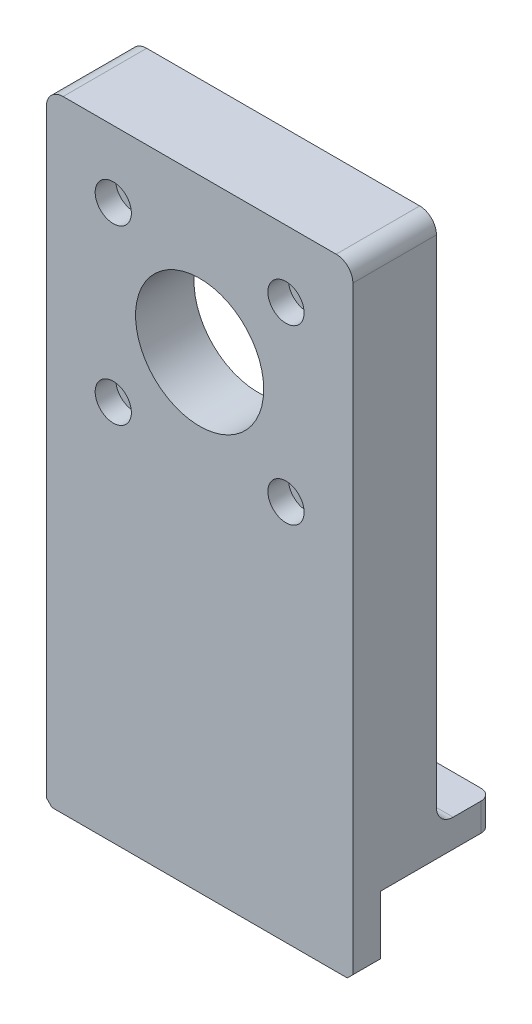
ISO-10303-21;
HEADER;
FILE_DESCRIPTION(('STEP AP214'),'2;1');
FILE_NAME('part.step','',(''),(''),'','','');
FILE_SCHEMA(('AUTOMOTIVE_DESIGN { 1 0 10303 214 1 1 1 1 }'));
ENDSEC;
DATA;
#1=APPLICATION_CONTEXT('core data for automotive mechanical design processes');
#2=APPLICATION_PROTOCOL_DEFINITION('international standard','automotive_design',2000,#1);
#3=PRODUCT_CONTEXT('',#1,'mechanical');
#4=PRODUCT('Part','Part','',(#3));
#5=PRODUCT_RELATED_PRODUCT_CATEGORY('part','',(#4));
#6=PRODUCT_DEFINITION_FORMATION('','',#4);
#7=PRODUCT_DEFINITION_CONTEXT('part definition',#1,'design');
#8=PRODUCT_DEFINITION('design','',#6,#7);
#9=PRODUCT_DEFINITION_SHAPE('','',#8);
#10=(LENGTH_UNIT() NAMED_UNIT(*) SI_UNIT(.MILLI.,.METRE.));
#11=(NAMED_UNIT(*) PLANE_ANGLE_UNIT() SI_UNIT($,.RADIAN.));
#12=(NAMED_UNIT(*) SI_UNIT($,.STERADIAN.) SOLID_ANGLE_UNIT());
#13=UNCERTAINTY_MEASURE_WITH_UNIT(LENGTH_MEASURE(1.E-05),#10,'distance_accuracy_value','');
#14=(GEOMETRIC_REPRESENTATION_CONTEXT(3) GLOBAL_UNCERTAINTY_ASSIGNED_CONTEXT((#13)) GLOBAL_UNIT_ASSIGNED_CONTEXT((#10,
#11,#12)) REPRESENTATION_CONTEXT('',''));
#15=CARTESIAN_POINT('',(0.,0.,0.));
#16=DIRECTION('',(0.,0.,1.));
#17=DIRECTION('',(1.,0.,0.));
#18=AXIS2_PLACEMENT_3D('',#15,#16,#17);
#19=CARTESIAN_POINT('',(0.,0.,-15.));
#20=DIRECTION('',(0.,0.,1.));
#21=DIRECTION('',(1.,0.,0.));
#22=AXIS2_PLACEMENT_3D('',#19,#20,#21);
#23=PLANE('',#22);
#24=DIRECTION('',(1.,0.,0.));
#25=VECTOR('',#24,1.);
#26=CARTESIAN_POINT('',(21.65,21.65,-15.));
#27=LINE('',#26,#25);
#28=CARTESIAN_POINT('',(-21.65,21.65,-15.));
#29=VERTEX_POINT('',#28);
#30=CARTESIAN_POINT('',(21.65,21.65,-15.));
#31=VERTEX_POINT('',#30);
#32=EDGE_CURVE('E212',#29,#31,#27,.T.);
#33=ORIENTED_EDGE('',*,*,#32,.F.);
#34=DIRECTION('',(0.,1.,0.));
#35=VECTOR('',#34,1.);
#36=CARTESIAN_POINT('',(-21.65,-21.65,-15.));
#37=LINE('',#36,#35);
#38=CARTESIAN_POINT('',(-21.65,-21.65,-15.));
#39=VERTEX_POINT('',#38);
#40=EDGE_CURVE('E181',#39,#29,#37,.T.);
#41=ORIENTED_EDGE('',*,*,#40,.F.);
#42=DIRECTION('',(-1.,0.,0.));
#43=VECTOR('',#42,1.);
#44=CARTESIAN_POINT('',(21.65,-21.65,-15.));
#45=LINE('',#44,#43);
#46=CARTESIAN_POINT('',(21.65,-21.65,-15.));
#47=VERTEX_POINT('',#46);
#48=EDGE_CURVE('E198',#47,#39,#45,.T.);
#49=ORIENTED_EDGE('',*,*,#48,.F.);
#50=DIRECTION('',(0.,-1.,0.));
#51=VECTOR('',#50,1.);
#52=CARTESIAN_POINT('',(21.65,-21.65,-15.));
#53=LINE('',#52,#51);
#54=EDGE_CURVE('E205',#31,#47,#53,.T.);
#55=ORIENTED_EDGE('',*,*,#54,.F.);
#56=EDGE_LOOP('',(#33,#41,#49,#55));
#57=FACE_BOUND('',#56,.T.);
#58=DIRECTION('',(0.,-1.,0.));
#59=VECTOR('',#58,1.);
#60=CARTESIAN_POINT('',(27.5,0.,-15.));
#61=LINE('',#60,#59);
#62=CARTESIAN_POINT('',(27.5,24.5,-15.));
#63=VERTEX_POINT('',#62);
#64=CARTESIAN_POINT('',(27.5,-64.5,-15.));
#65=VERTEX_POINT('',#64);
#66=EDGE_CURVE('E240',#63,#65,#61,.T.);
#67=ORIENTED_EDGE('',*,*,#66,.T.);
#68=DIRECTION('',(1.,0.,0.));
#69=VECTOR('',#68,1.);
#70=CARTESIAN_POINT('',(-27.5,-64.5,-15.));
#71=LINE('',#70,#69);
#72=CARTESIAN_POINT('',(-27.5,-64.5,-15.));
#73=VERTEX_POINT('',#72);
#74=EDGE_CURVE('E61',#65,#73,#71,.F.);
#75=ORIENTED_EDGE('',*,*,#74,.T.);
#76=DIRECTION('',(0.,-1.,0.));
#77=VECTOR('',#76,1.);
#78=CARTESIAN_POINT('',(-27.5,0.,-15.));
#79=LINE('',#78,#77);
#80=CARTESIAN_POINT('',(-27.5,24.5,-15.));
#81=VERTEX_POINT('',#80);
#82=EDGE_CURVE('E247',#81,#73,#79,.T.);
#83=ORIENTED_EDGE('',*,*,#82,.F.);
#84=CARTESIAN_POINT('',(-24.5,24.5,-15.));
#85=DIRECTION('',(0.,0.,1.));
#86=DIRECTION('',(1.,0.,0.));
#87=AXIS2_PLACEMENT_3D('',#84,#85,#86);
#88=CIRCLE('',#87,3.);
#89=CARTESIAN_POINT('',(-24.5,27.5,-15.));
#90=VERTEX_POINT('',#89);
#91=EDGE_CURVE('E244',#90,#81,#88,.T.);
#92=ORIENTED_EDGE('',*,*,#91,.F.);
#93=DIRECTION('',(1.,0.,0.));
#94=VECTOR('',#93,1.);
#95=CARTESIAN_POINT('',(0.,27.5,-15.));
#96=LINE('',#95,#94);
#97=CARTESIAN_POINT('',(24.5,27.5,-15.));
#98=VERTEX_POINT('',#97);
#99=EDGE_CURVE('E243',#90,#98,#96,.T.);
#100=ORIENTED_EDGE('',*,*,#99,.T.);
#101=CARTESIAN_POINT('',(24.5,24.5,-15.));
#102=DIRECTION('',(0.,0.,1.));
#103=DIRECTION('',(1.,0.,0.));
#104=AXIS2_PLACEMENT_3D('',#101,#102,#103);
#105=CIRCLE('',#104,3.);
#106=EDGE_CURVE('E237',#63,#98,#105,.T.);
#107=ORIENTED_EDGE('',*,*,#106,.F.);
#108=EDGE_LOOP('',(#67,#75,#83,#92,#100,#107));
#109=FACE_BOUND('',#108,.T.);
#110=ADVANCED_FACE('F43',(#57,#109),#23,.F.);
#111=CARTESIAN_POINT('',(0.,-72.5,-15.));
#112=DIRECTION('',(0.,1.,0.));
#113=DIRECTION('',(0.,0.,1.));
#114=AXIS2_PLACEMENT_3D('',#111,#112,#113);
#115=PLANE('',#114);
#116=DIRECTION('',(0.,0.,1.));
#117=VECTOR('',#116,1.);
#118=CARTESIAN_POINT('',(-27.5,-72.5,-15.));
#119=LINE('',#118,#117);
#120=CARTESIAN_POINT('',(-27.5,-72.5,-23.));
#121=VERTEX_POINT('',#120);
#122=CARTESIAN_POINT('',(-27.5,-72.5,-5.));
#123=VERTEX_POINT('',#122);
#124=EDGE_CURVE('E269',#121,#123,#119,.T.);
#125=ORIENTED_EDGE('',*,*,#124,.F.);
#126=CARTESIAN_POINT('',(-25.5,-72.5,-23.));
#127=DIRECTION('',(0.,1.,0.));
#128=DIRECTION('',(0.,0.,1.));
#129=AXIS2_PLACEMENT_3D('',#126,#127,#128);
#130=CIRCLE('',#129,2.);
#131=CARTESIAN_POINT('',(-25.5,-72.5,-25.));
#132=VERTEX_POINT('',#131);
#133=EDGE_CURVE('E315',#121,#132,#130,.F.);
#134=ORIENTED_EDGE('',*,*,#133,.T.);
#135=DIRECTION('',(-1.,0.,0.));
#136=VECTOR('',#135,1.);
#137=CARTESIAN_POINT('',(27.5,-72.5,-25.));
#138=LINE('',#137,#136);
#139=CARTESIAN_POINT('',(25.5,-72.5,-25.));
#140=VERTEX_POINT('',#139);
#141=EDGE_CURVE('E336',#140,#132,#138,.T.);
#142=ORIENTED_EDGE('',*,*,#141,.F.);
#143=CARTESIAN_POINT('',(25.5,-72.5,-23.));
#144=DIRECTION('',(0.,1.,0.));
#145=DIRECTION('',(0.,0.,1.));
#146=AXIS2_PLACEMENT_3D('',#143,#144,#145);
#147=CIRCLE('',#146,2.);
#148=CARTESIAN_POINT('',(27.5,-72.5,-23.));
#149=VERTEX_POINT('',#148);
#150=EDGE_CURVE('E309',#140,#149,#147,.F.);
#151=ORIENTED_EDGE('',*,*,#150,.T.);
#152=DIRECTION('',(0.,0.,1.));
#153=VECTOR('',#152,1.);
#154=CARTESIAN_POINT('',(27.5,-72.5,-15.));
#155=LINE('',#154,#153);
#156=CARTESIAN_POINT('',(27.5,-72.5,-5.));
#157=VERTEX_POINT('',#156);
#158=EDGE_CURVE('E270',#149,#157,#155,.T.);
#159=ORIENTED_EDGE('',*,*,#158,.T.);
#160=DIRECTION('',(1.,0.,0.));
#161=VECTOR('',#160,1.);
#162=CARTESIAN_POINT('',(-27.5,-72.5,-5.));
#163=LINE('',#162,#161);
#164=EDGE_CURVE('E224',#123,#157,#163,.T.);
#165=ORIENTED_EDGE('',*,*,#164,.F.);
#166=EDGE_LOOP('',(#125,#134,#142,#151,#159,#165));
#167=FACE_BOUND('',#166,.T.);
#168=ADVANCED_FACE('F407',(#167),#115,.F.);
#169=CARTESIAN_POINT('',(27.5,0.,-15.));
#170=DIRECTION('',(-1.,0.,0.));
#171=DIRECTION('',(0.,-1.,0.));
#172=AXIS2_PLACEMENT_3D('',#169,#170,#171);
#173=PLANE('',#172);
#174=ORIENTED_EDGE('',*,*,#158,.F.);
#175=DIRECTION('',(0.,-1.,0.));
#176=VECTOR('',#175,1.);
#177=CARTESIAN_POINT('',(27.5,0.,-23.));
#178=LINE('',#177,#176);
#179=CARTESIAN_POINT('',(27.5,-67.5,-23.));
#180=VERTEX_POINT('',#179);
#181=EDGE_CURVE('E313',#149,#180,#178,.F.);
#182=ORIENTED_EDGE('',*,*,#181,.T.);
#183=DIRECTION('',(0.,0.,1.));
#184=VECTOR('',#183,1.);
#185=CARTESIAN_POINT('',(27.5,-67.5,-25.));
#186=LINE('',#185,#184);
#187=CARTESIAN_POINT('',(27.5,-67.5,-18.));
#188=VERTEX_POINT('',#187);
#189=EDGE_CURVE('E321',#180,#188,#186,.T.);
#190=ORIENTED_EDGE('',*,*,#189,.T.);
#191=CARTESIAN_POINT('',(27.5,-64.5,-18.));
#192=DIRECTION('',(-1.,0.,0.));
#193=DIRECTION('',(0.,-1.,0.));
#194=AXIS2_PLACEMENT_3D('',#191,#192,#193);
#195=CIRCLE('',#194,3.);
#196=EDGE_CURVE('E51',#188,#65,#195,.T.);
#197=ORIENTED_EDGE('',*,*,#196,.T.);
#198=ORIENTED_EDGE('',*,*,#66,.F.);
#199=DIRECTION('',(0.,0.,1.));
#200=VECTOR('',#199,1.);
#201=CARTESIAN_POINT('',(27.5,24.5,-15.));
#202=LINE('',#201,#200);
#203=CARTESIAN_POINT('',(27.5,24.5,0.));
#204=VERTEX_POINT('',#203);
#205=EDGE_CURVE('E249',#63,#204,#202,.T.);
#206=ORIENTED_EDGE('',*,*,#205,.T.);
#207=DIRECTION('',(0.,-1.,0.));
#208=VECTOR('',#207,1.);
#209=CARTESIAN_POINT('',(27.5,0.,0.));
#210=LINE('',#209,#208);
#211=CARTESIAN_POINT('',(27.5,-83.,0.));
#212=VERTEX_POINT('',#211);
#213=EDGE_CURVE('E254',#204,#212,#210,.T.);
#214=ORIENTED_EDGE('',*,*,#213,.T.);
#215=DIRECTION('',(0.,0.,-1.));
#216=VECTOR('',#215,1.);
#217=CARTESIAN_POINT('',(27.5,-83.,-15.));
#218=LINE('',#217,#216);
#219=CARTESIAN_POINT('',(27.5,-83.,-5.));
#220=VERTEX_POINT('',#219);
#221=EDGE_CURVE('E288',#212,#220,#218,.T.);
#222=ORIENTED_EDGE('',*,*,#221,.T.);
#223=DIRECTION('',(0.,1.,0.));
#224=VECTOR('',#223,1.);
#225=CARTESIAN_POINT('',(27.5,-84.,-5.));
#226=LINE('',#225,#224);
#227=EDGE_CURVE('E226',#220,#157,#226,.T.);
#228=ORIENTED_EDGE('',*,*,#227,.T.);
#229=EDGE_LOOP('',(#174,#182,#190,#197,#198,#206,#214,#222,#228));
#230=FACE_BOUND('',#229,.T.);
#231=ADVANCED_FACE('F331',(#230),#173,.F.);
#232=CARTESIAN_POINT('',(-27.5,0.,-15.));
#233=DIRECTION('',(-1.,0.,0.));
#234=DIRECTION('',(0.,-1.,0.));
#235=AXIS2_PLACEMENT_3D('',#232,#233,#234);
#236=PLANE('',#235);
#237=DIRECTION('',(0.,0.,1.));
#238=VECTOR('',#237,1.);
#239=CARTESIAN_POINT('',(-27.5,-67.5,-25.));
#240=LINE('',#239,#238);
#241=CARTESIAN_POINT('',(-27.5,-67.5,-23.));
#242=VERTEX_POINT('',#241);
#243=CARTESIAN_POINT('',(-27.5,-67.5,-18.));
#244=VERTEX_POINT('',#243);
#245=EDGE_CURVE('E326',#242,#244,#240,.T.);
#246=ORIENTED_EDGE('',*,*,#245,.F.);
#247=DIRECTION('',(0.,1.,0.));
#248=VECTOR('',#247,1.);
#249=CARTESIAN_POINT('',(-27.5,-72.5,-23.));
#250=LINE('',#249,#248);
#251=EDGE_CURVE('E308',#242,#121,#250,.F.);
#252=ORIENTED_EDGE('',*,*,#251,.T.);
#253=ORIENTED_EDGE('',*,*,#124,.T.);
#254=DIRECTION('',(0.,1.,0.));
#255=VECTOR('',#254,1.);
#256=CARTESIAN_POINT('',(-27.5,-84.,-5.));
#257=LINE('',#256,#255);
#258=CARTESIAN_POINT('',(-27.5,-83.,-5.));
#259=VERTEX_POINT('',#258);
#260=EDGE_CURVE('E231',#259,#123,#257,.T.);
#261=ORIENTED_EDGE('',*,*,#260,.F.);
#262=DIRECTION('',(0.,0.,1.));
#263=VECTOR('',#262,1.);
#264=CARTESIAN_POINT('',(-27.5,-83.,0.));
#265=LINE('',#264,#263);
#266=CARTESIAN_POINT('',(-27.5,-83.,0.));
#267=VERTEX_POINT('',#266);
#268=EDGE_CURVE('E295',#259,#267,#265,.T.);
#269=ORIENTED_EDGE('',*,*,#268,.T.);
#270=DIRECTION('',(0.,-1.,0.));
#271=VECTOR('',#270,1.);
#272=CARTESIAN_POINT('',(-27.5,0.,0.));
#273=LINE('',#272,#271);
#274=CARTESIAN_POINT('',(-27.5,24.5,0.));
#275=VERTEX_POINT('',#274);
#276=EDGE_CURVE('E239',#275,#267,#273,.T.);
#277=ORIENTED_EDGE('',*,*,#276,.F.);
#278=DIRECTION('',(0.,0.,1.));
#279=VECTOR('',#278,1.);
#280=CARTESIAN_POINT('',(-27.5,24.5,-15.));
#281=LINE('',#280,#279);
#282=EDGE_CURVE('E275',#81,#275,#281,.T.);
#283=ORIENTED_EDGE('',*,*,#282,.F.);
#284=ORIENTED_EDGE('',*,*,#82,.T.);
#285=CARTESIAN_POINT('',(-27.5,-64.5,-18.));
#286=DIRECTION('',(-1.,0.,0.));
#287=DIRECTION('',(0.,-1.,0.));
#288=AXIS2_PLACEMENT_3D('',#285,#286,#287);
#289=CIRCLE('',#288,3.);
#290=EDGE_CURVE('E11',#73,#244,#289,.F.);
#291=ORIENTED_EDGE('',*,*,#290,.T.);
#292=EDGE_LOOP('',(#246,#252,#253,#261,#269,#277,#283,#284,#291));
#293=FACE_BOUND('',#292,.T.);
#294=ADVANCED_FACE('F424',(#293),#236,.T.);
#295=CARTESIAN_POINT('',(-24.5,24.5,-15.));
#296=DIRECTION('',(0.,0.,1.));
#297=DIRECTION('',(1.,0.,0.));
#298=AXIS2_PLACEMENT_3D('',#295,#296,#297);
#299=CYLINDRICAL_SURFACE('',#298,3.);
#300=CARTESIAN_POINT('',(-24.5,24.5,0.));
#301=DIRECTION('',(0.,0.,1.));
#302=DIRECTION('',(1.,0.,0.));
#303=AXIS2_PLACEMENT_3D('',#300,#301,#302);
#304=CIRCLE('',#303,3.);
#305=CARTESIAN_POINT('',(-24.5,27.5,0.));
#306=VERTEX_POINT('',#305);
#307=EDGE_CURVE('E261',#306,#275,#304,.T.);
#308=ORIENTED_EDGE('',*,*,#307,.F.);
#309=DIRECTION('',(0.,0.,1.));
#310=VECTOR('',#309,1.);
#311=CARTESIAN_POINT('',(-24.5,27.5,-15.));
#312=LINE('',#311,#310);
#313=EDGE_CURVE('E274',#90,#306,#312,.T.);
#314=ORIENTED_EDGE('',*,*,#313,.F.);
#315=ORIENTED_EDGE('',*,*,#91,.T.);
#316=ORIENTED_EDGE('',*,*,#282,.T.);
#317=EDGE_LOOP('',(#308,#314,#315,#316));
#318=FACE_BOUND('',#317,.T.);
#319=ADVANCED_FACE('F426',(#318),#299,.T.);
#320=CARTESIAN_POINT('',(0.,27.5,-15.));
#321=DIRECTION('',(0.,-1.,0.));
#322=DIRECTION('',(0.,0.,-1.));
#323=AXIS2_PLACEMENT_3D('',#320,#321,#322);
#324=PLANE('',#323);
#325=DIRECTION('',(1.,0.,0.));
#326=VECTOR('',#325,1.);
#327=CARTESIAN_POINT('',(0.,27.5,0.));
#328=LINE('',#327,#326);
#329=CARTESIAN_POINT('',(24.5,27.5,0.));
#330=VERTEX_POINT('',#329);
#331=EDGE_CURVE('E256',#306,#330,#328,.T.);
#332=ORIENTED_EDGE('',*,*,#331,.T.);
#333=DIRECTION('',(0.,0.,1.));
#334=VECTOR('',#333,1.);
#335=CARTESIAN_POINT('',(24.5,27.5,-15.));
#336=LINE('',#335,#334);
#337=EDGE_CURVE('E277',#98,#330,#336,.T.);
#338=ORIENTED_EDGE('',*,*,#337,.F.);
#339=ORIENTED_EDGE('',*,*,#99,.F.);
#340=ORIENTED_EDGE('',*,*,#313,.T.);
#341=EDGE_LOOP('',(#332,#338,#339,#340));
#342=FACE_BOUND('',#341,.T.);
#343=ADVANCED_FACE('F435',(#342),#324,.F.);
#344=CARTESIAN_POINT('',(0.,0.,-15.));
#345=DIRECTION('',(0.,0.,1.));
#346=DIRECTION('',(1.,0.,0.));
#347=AXIS2_PLACEMENT_3D('',#344,#345,#346);
#348=CYLINDRICAL_SURFACE('',#347,11.5);
#349=CARTESIAN_POINT('',(0.,0.,-10.5));
#350=DIRECTION('',(0.,0.,1.));
#351=DIRECTION('',(1.,0.,0.));
#352=AXIS2_PLACEMENT_3D('',#349,#350,#351);
#353=CIRCLE('',#352,11.5);
#354=CARTESIAN_POINT('',(11.5,0.,-10.5));
#355=VERTEX_POINT('',#354);
#356=EDGE_CURVE('E216',#355,#355,#353,.F.);
#357=ORIENTED_EDGE('',*,*,#356,.T.);
#358=EDGE_LOOP('',(#357));
#359=FACE_BOUND('',#358,.T.);
#360=CARTESIAN_POINT('',(0.,0.,0.));
#361=DIRECTION('',(0.,0.,1.));
#362=DIRECTION('',(1.,0.,0.));
#363=AXIS2_PLACEMENT_3D('',#360,#361,#362);
#364=CIRCLE('',#363,11.5);
#365=CARTESIAN_POINT('',(11.5,0.,0.));
#366=VERTEX_POINT('',#365);
#367=EDGE_CURVE('E236',#366,#366,#364,.T.);
#368=ORIENTED_EDGE('',*,*,#367,.T.);
#369=EDGE_LOOP('',(#368));
#370=FACE_BOUND('',#369,.T.);
#371=ADVANCED_FACE('F436',(#359,#370),#348,.F.);
#372=CARTESIAN_POINT('',(24.5,24.5,-15.));
#373=DIRECTION('',(0.,0.,1.));
#374=DIRECTION('',(1.,0.,0.));
#375=AXIS2_PLACEMENT_3D('',#372,#373,#374);
#376=CYLINDRICAL_SURFACE('',#375,3.);
#377=CARTESIAN_POINT('',(24.5,24.5,0.));
#378=DIRECTION('',(0.,0.,1.));
#379=DIRECTION('',(1.,0.,0.));
#380=AXIS2_PLACEMENT_3D('',#377,#378,#379);
#381=CIRCLE('',#380,3.);
#382=EDGE_CURVE('E257',#204,#330,#381,.T.);
#383=ORIENTED_EDGE('',*,*,#382,.F.);
#384=ORIENTED_EDGE('',*,*,#205,.F.);
#385=ORIENTED_EDGE('',*,*,#106,.T.);
#386=ORIENTED_EDGE('',*,*,#337,.T.);
#387=EDGE_LOOP('',(#383,#384,#385,#386));
#388=FACE_BOUND('',#387,.T.);
#389=ADVANCED_FACE('F422',(#388),#376,.T.);
#390=CARTESIAN_POINT('',(0.,0.,0.));
#391=DIRECTION('',(0.,0.,1.));
#392=DIRECTION('',(1.,0.,0.));
#393=AXIS2_PLACEMENT_3D('',#390,#391,#392);
#394=PLANE('',#393);
#395=CARTESIAN_POINT('',(15.5,15.5,0.));
#396=DIRECTION('',(0.,0.,1.));
#397=DIRECTION('',(1.,0.,0.));
#398=AXIS2_PLACEMENT_3D('',#395,#396,#397);
#399=CIRCLE('',#398,3.25);
#400=CARTESIAN_POINT('',(18.75,15.5,0.));
#401=VERTEX_POINT('',#400);
#402=EDGE_CURVE('E334',#401,#401,#399,.T.);
#403=ORIENTED_EDGE('',*,*,#402,.F.);
#404=EDGE_LOOP('',(#403));
#405=FACE_BOUND('',#404,.T.);
#406=CARTESIAN_POINT('',(-15.5,-15.5,0.));
#407=DIRECTION('',(0.,0.,1.));
#408=DIRECTION('',(1.,0.,0.));
#409=AXIS2_PLACEMENT_3D('',#406,#407,#408);
#410=CIRCLE('',#409,3.25);
#411=CARTESIAN_POINT('',(-12.25,-15.5,0.));
#412=VERTEX_POINT('',#411);
#413=EDGE_CURVE('E353',#412,#412,#410,.T.);
#414=ORIENTED_EDGE('',*,*,#413,.F.);
#415=EDGE_LOOP('',(#414));
#416=FACE_BOUND('',#415,.T.);
#417=CARTESIAN_POINT('',(-15.5,15.5,0.));
#418=DIRECTION('',(0.,0.,1.));
#419=DIRECTION('',(1.,0.,0.));
#420=AXIS2_PLACEMENT_3D('',#417,#418,#419);
#421=CIRCLE('',#420,3.25);
#422=CARTESIAN_POINT('',(-12.25,15.5,0.));
#423=VERTEX_POINT('',#422);
#424=EDGE_CURVE('E362',#423,#423,#421,.T.);
#425=ORIENTED_EDGE('',*,*,#424,.F.);
#426=EDGE_LOOP('',(#425));
#427=FACE_BOUND('',#426,.T.);
#428=CARTESIAN_POINT('',(15.5,-15.5,0.));
#429=DIRECTION('',(0.,0.,1.));
#430=DIRECTION('',(1.,0.,0.));
#431=AXIS2_PLACEMENT_3D('',#428,#429,#430);
#432=CIRCLE('',#431,3.25);
#433=CARTESIAN_POINT('',(18.75,-15.5,0.));
#434=VERTEX_POINT('',#433);
#435=EDGE_CURVE('E380',#434,#434,#432,.T.);
#436=ORIENTED_EDGE('',*,*,#435,.F.);
#437=EDGE_LOOP('',(#436));
#438=FACE_BOUND('',#437,.T.);
#439=ORIENTED_EDGE('',*,*,#367,.F.);
#440=EDGE_LOOP('',(#439));
#441=FACE_BOUND('',#440,.T.);
#442=DIRECTION('',(-1.,0.,0.));
#443=VECTOR('',#442,1.);
#444=CARTESIAN_POINT('',(-27.5,-84.,0.));
#445=LINE('',#444,#443);
#446=CARTESIAN_POINT('',(26.5,-84.,0.));
#447=VERTEX_POINT('',#446);
#448=CARTESIAN_POINT('',(-26.5,-84.,0.));
#449=VERTEX_POINT('',#448);
#450=EDGE_CURVE('E222',#447,#449,#445,.T.);
#451=ORIENTED_EDGE('',*,*,#450,.F.);
#452=DIRECTION('',(-0.707106781186543,-0.707106781186552,0.));
#453=VECTOR('',#452,1.);
#454=CARTESIAN_POINT('',(55.2500000000002,-55.2499999999994,0.));
#455=LINE('',#454,#453);
#456=EDGE_CURVE('E286',#447,#212,#455,.F.);
#457=ORIENTED_EDGE('',*,*,#456,.T.);
#458=ORIENTED_EDGE('',*,*,#213,.F.);
#459=ORIENTED_EDGE('',*,*,#382,.T.);
#460=ORIENTED_EDGE('',*,*,#331,.F.);
#461=ORIENTED_EDGE('',*,*,#307,.T.);
#462=ORIENTED_EDGE('',*,*,#276,.T.);
#463=DIRECTION('',(0.707106781186543,-0.707106781186552,0.));
#464=VECTOR('',#463,1.);
#465=CARTESIAN_POINT('',(-55.2500000000002,-55.2499999999994,0.));
#466=LINE('',#465,#464);
#467=EDGE_CURVE('E283',#267,#449,#466,.T.);
#468=ORIENTED_EDGE('',*,*,#467,.T.);
#469=EDGE_LOOP('',(#451,#457,#458,#459,#460,#461,#462,#468));
#470=FACE_BOUND('',#469,.T.);
#471=ADVANCED_FACE('F419',(#405,#416,#427,#438,#441,#470),#394,.T.);
#472=CARTESIAN_POINT('',(-27.5,-84.,-5.));
#473=DIRECTION('',(0.,0.,1.));
#474=DIRECTION('',(1.,0.,0.));
#475=AXIS2_PLACEMENT_3D('',#472,#473,#474);
#476=PLANE('',#475);
#477=ORIENTED_EDGE('',*,*,#227,.F.);
#478=DIRECTION('',(0.707106781186543,0.707106781186552,0.));
#479=VECTOR('',#478,1.);
#480=CARTESIAN_POINT('',(26.5,-84.,-5.));
#481=LINE('',#480,#479);
#482=CARTESIAN_POINT('',(26.5,-84.,-5.));
#483=VERTEX_POINT('',#482);
#484=EDGE_CURVE('E292',#220,#483,#481,.F.);
#485=ORIENTED_EDGE('',*,*,#484,.T.);
#486=DIRECTION('',(1.,0.,0.));
#487=VECTOR('',#486,1.);
#488=CARTESIAN_POINT('',(-27.5,-84.,-5.));
#489=LINE('',#488,#487);
#490=CARTESIAN_POINT('',(-26.5,-84.,-5.));
#491=VERTEX_POINT('',#490);
#492=EDGE_CURVE('E221',#491,#483,#489,.T.);
#493=ORIENTED_EDGE('',*,*,#492,.F.);
#494=DIRECTION('',(-0.707106781186543,0.707106781186552,0.));
#495=VECTOR('',#494,1.);
#496=CARTESIAN_POINT('',(-26.5,-84.,-5.));
#497=LINE('',#496,#495);
#498=EDGE_CURVE('E289',#491,#259,#497,.T.);
#499=ORIENTED_EDGE('',*,*,#498,.T.);
#500=ORIENTED_EDGE('',*,*,#260,.T.);
#501=ORIENTED_EDGE('',*,*,#164,.T.);
#502=EDGE_LOOP('',(#477,#485,#493,#499,#500,#501));
#503=FACE_BOUND('',#502,.T.);
#504=ADVANCED_FACE('F418',(#503),#476,.F.);
#505=CARTESIAN_POINT('',(0.,-84.,0.));
#506=DIRECTION('',(0.,1.,0.));
#507=DIRECTION('',(0.,0.,1.));
#508=AXIS2_PLACEMENT_3D('',#505,#506,#507);
#509=PLANE('',#508);
#510=ORIENTED_EDGE('',*,*,#492,.T.);
#511=DIRECTION('',(0.,0.,1.));
#512=VECTOR('',#511,1.);
#513=CARTESIAN_POINT('',(26.5,-84.,0.));
#514=LINE('',#513,#512);
#515=EDGE_CURVE('E284',#483,#447,#514,.T.);
#516=ORIENTED_EDGE('',*,*,#515,.T.);
#517=ORIENTED_EDGE('',*,*,#450,.T.);
#518=DIRECTION('',(0.,0.,-1.));
#519=VECTOR('',#518,1.);
#520=CARTESIAN_POINT('',(-26.5,-84.,-5.));
#521=LINE('',#520,#519);
#522=EDGE_CURVE('E267',#449,#491,#521,.T.);
#523=ORIENTED_EDGE('',*,*,#522,.T.);
#524=EDGE_LOOP('',(#510,#516,#517,#523));
#525=FACE_BOUND('',#524,.T.);
#526=ADVANCED_FACE('F455',(#525),#509,.F.);
#527=CARTESIAN_POINT('',(26.5,-84.,0.));
#528=DIRECTION('',(-0.707106781186552,0.707106781186543,0.));
#529=DIRECTION('',(0.,0.,1.));
#530=AXIS2_PLACEMENT_3D('',#527,#528,#529);
#531=PLANE('',#530);
#532=ORIENTED_EDGE('',*,*,#484,.F.);
#533=ORIENTED_EDGE('',*,*,#221,.F.);
#534=ORIENTED_EDGE('',*,*,#456,.F.);
#535=ORIENTED_EDGE('',*,*,#515,.F.);
#536=EDGE_LOOP('',(#532,#533,#534,#535));
#537=FACE_BOUND('',#536,.T.);
#538=ADVANCED_FACE('F447',(#537),#531,.F.);
#539=CARTESIAN_POINT('',(-26.5,-84.,0.));
#540=DIRECTION('',(-0.707106781186552,-0.707106781186543,0.));
#541=DIRECTION('',(0.,0.,1.));
#542=AXIS2_PLACEMENT_3D('',#539,#540,#541);
#543=PLANE('',#542);
#544=ORIENTED_EDGE('',*,*,#467,.F.);
#545=ORIENTED_EDGE('',*,*,#268,.F.);
#546=ORIENTED_EDGE('',*,*,#498,.F.);
#547=ORIENTED_EDGE('',*,*,#522,.F.);
#548=EDGE_LOOP('',(#544,#545,#546,#547));
#549=FACE_BOUND('',#548,.T.);
#550=ADVANCED_FACE('F454',(#549),#543,.T.);
#551=CARTESIAN_POINT('',(0.,0.,-10.5));
#552=DIRECTION('',(0.,0.,1.));
#553=DIRECTION('',(1.,0.,0.));
#554=AXIS2_PLACEMENT_3D('',#551,#552,#553);
#555=PLANE('',#554);
#556=CARTESIAN_POINT('',(15.5,15.5,-10.5));
#557=DIRECTION('',(0.,0.,1.));
#558=DIRECTION('',(1.,0.,0.));
#559=AXIS2_PLACEMENT_3D('',#556,#557,#558);
#560=CIRCLE('',#559,1.75);
#561=CARTESIAN_POINT('',(17.25,15.5,-10.5));
#562=VERTEX_POINT('',#561);
#563=EDGE_CURVE('E347',#562,#562,#560,.T.);
#564=ORIENTED_EDGE('',*,*,#563,.T.);
#565=EDGE_LOOP('',(#564));
#566=FACE_BOUND('',#565,.T.);
#567=CARTESIAN_POINT('',(-15.5,-15.5,-10.5));
#568=DIRECTION('',(0.,0.,1.));
#569=DIRECTION('',(1.,0.,0.));
#570=AXIS2_PLACEMENT_3D('',#567,#568,#569);
#571=CIRCLE('',#570,1.75);
#572=CARTESIAN_POINT('',(-13.75,-15.5,-10.5));
#573=VERTEX_POINT('',#572);
#574=EDGE_CURVE('E365',#573,#573,#571,.T.);
#575=ORIENTED_EDGE('',*,*,#574,.T.);
#576=EDGE_LOOP('',(#575));
#577=FACE_BOUND('',#576,.T.);
#578=CARTESIAN_POINT('',(-15.5,15.5,-10.5));
#579=DIRECTION('',(0.,0.,1.));
#580=DIRECTION('',(1.,0.,0.));
#581=AXIS2_PLACEMENT_3D('',#578,#579,#580);
#582=CIRCLE('',#581,1.75);
#583=CARTESIAN_POINT('',(-13.75,15.5,-10.5));
#584=VERTEX_POINT('',#583);
#585=EDGE_CURVE('E372',#584,#584,#582,.T.);
#586=ORIENTED_EDGE('',*,*,#585,.T.);
#587=EDGE_LOOP('',(#586));
#588=FACE_BOUND('',#587,.T.);
#589=CARTESIAN_POINT('',(15.5,-15.5,-10.5));
#590=DIRECTION('',(0.,0.,1.));
#591=DIRECTION('',(1.,0.,0.));
#592=AXIS2_PLACEMENT_3D('',#589,#590,#591);
#593=CIRCLE('',#592,1.75);
#594=CARTESIAN_POINT('',(17.25,-15.5,-10.5));
#595=VERTEX_POINT('',#594);
#596=EDGE_CURVE('E204',#595,#595,#593,.T.);
#597=ORIENTED_EDGE('',*,*,#596,.T.);
#598=EDGE_LOOP('',(#597));
#599=FACE_BOUND('',#598,.T.);
#600=DIRECTION('',(0.,1.,0.));
#601=VECTOR('',#600,1.);
#602=CARTESIAN_POINT('',(-21.65,-21.65,-10.5));
#603=LINE('',#602,#601);
#604=CARTESIAN_POINT('',(-21.65,-21.65,-10.5));
#605=VERTEX_POINT('',#604);
#606=CARTESIAN_POINT('',(-21.65,21.65,-10.5));
#607=VERTEX_POINT('',#606);
#608=EDGE_CURVE('E178',#605,#607,#603,.T.);
#609=ORIENTED_EDGE('',*,*,#608,.T.);
#610=DIRECTION('',(1.,0.,0.));
#611=VECTOR('',#610,1.);
#612=CARTESIAN_POINT('',(21.65,21.65,-10.5));
#613=LINE('',#612,#611);
#614=CARTESIAN_POINT('',(21.65,21.65,-10.5));
#615=VERTEX_POINT('',#614);
#616=EDGE_CURVE('E186',#607,#615,#613,.T.);
#617=ORIENTED_EDGE('',*,*,#616,.T.);
#618=DIRECTION('',(0.,-1.,0.));
#619=VECTOR('',#618,1.);
#620=CARTESIAN_POINT('',(21.65,-21.65,-10.5));
#621=LINE('',#620,#619);
#622=CARTESIAN_POINT('',(21.65,-21.65,-10.5));
#623=VERTEX_POINT('',#622);
#624=EDGE_CURVE('E191',#615,#623,#621,.T.);
#625=ORIENTED_EDGE('',*,*,#624,.T.);
#626=DIRECTION('',(-1.,0.,0.));
#627=VECTOR('',#626,1.);
#628=CARTESIAN_POINT('',(21.65,-21.65,-10.5));
#629=LINE('',#628,#627);
#630=EDGE_CURVE('E187',#623,#605,#629,.T.);
#631=ORIENTED_EDGE('',*,*,#630,.T.);
#632=EDGE_LOOP('',(#609,#617,#625,#631));
#633=FACE_BOUND('',#632,.T.);
#634=ORIENTED_EDGE('',*,*,#356,.F.);
#635=EDGE_LOOP('',(#634));
#636=FACE_BOUND('',#635,.T.);
#637=ADVANCED_FACE('F199',(#566,#577,#588,#599,#633,#636),#555,.F.);
#638=CARTESIAN_POINT('',(-21.65,-21.65,-10.5));
#639=DIRECTION('',(-1.,0.,0.));
#640=DIRECTION('',(0.,0.,1.));
#641=AXIS2_PLACEMENT_3D('',#638,#639,#640);
#642=PLANE('',#641);
#643=ORIENTED_EDGE('',*,*,#40,.T.);
#644=DIRECTION('',(0.,0.,-1.));
#645=VECTOR('',#644,1.);
#646=CARTESIAN_POINT('',(-21.65,21.65,-10.5));
#647=LINE('',#646,#645);
#648=EDGE_CURVE('E172',#607,#29,#647,.T.);
#649=ORIENTED_EDGE('',*,*,#648,.F.);
#650=ORIENTED_EDGE('',*,*,#608,.F.);
#651=DIRECTION('',(0.,0.,-1.));
#652=VECTOR('',#651,1.);
#653=CARTESIAN_POINT('',(-21.65,-21.65,-10.5));
#654=LINE('',#653,#652);
#655=EDGE_CURVE('E213',#605,#39,#654,.T.);
#656=ORIENTED_EDGE('',*,*,#655,.T.);
#657=EDGE_LOOP('',(#643,#649,#650,#656));
#658=FACE_BOUND('',#657,.T.);
#659=ADVANCED_FACE('F176',(#658),#642,.F.);
#660=CARTESIAN_POINT('',(21.65,-21.65,-10.5));
#661=DIRECTION('',(0.,-1.,0.));
#662=DIRECTION('',(0.,0.,-1.));
#663=AXIS2_PLACEMENT_3D('',#660,#661,#662);
#664=PLANE('',#663);
#665=ORIENTED_EDGE('',*,*,#48,.T.);
#666=ORIENTED_EDGE('',*,*,#655,.F.);
#667=ORIENTED_EDGE('',*,*,#630,.F.);
#668=DIRECTION('',(0.,0.,-1.));
#669=VECTOR('',#668,1.);
#670=CARTESIAN_POINT('',(21.65,-21.65,-10.5));
#671=LINE('',#670,#669);
#672=EDGE_CURVE('E220',#623,#47,#671,.T.);
#673=ORIENTED_EDGE('',*,*,#672,.T.);
#674=EDGE_LOOP('',(#665,#666,#667,#673));
#675=FACE_BOUND('',#674,.T.);
#676=ADVANCED_FACE('F508',(#675),#664,.F.);
#677=CARTESIAN_POINT('',(21.65,-21.65,-10.5));
#678=DIRECTION('',(1.,0.,0.));
#679=DIRECTION('',(0.,0.,-1.));
#680=AXIS2_PLACEMENT_3D('',#677,#678,#679);
#681=PLANE('',#680);
#682=ORIENTED_EDGE('',*,*,#54,.T.);
#683=ORIENTED_EDGE('',*,*,#672,.F.);
#684=ORIENTED_EDGE('',*,*,#624,.F.);
#685=DIRECTION('',(0.,0.,-1.));
#686=VECTOR('',#685,1.);
#687=CARTESIAN_POINT('',(21.65,21.65,-10.5));
#688=LINE('',#687,#686);
#689=EDGE_CURVE('E184',#615,#31,#688,.T.);
#690=ORIENTED_EDGE('',*,*,#689,.T.);
#691=EDGE_LOOP('',(#682,#683,#684,#690));
#692=FACE_BOUND('',#691,.T.);
#693=ADVANCED_FACE('F405',(#692),#681,.F.);
#694=CARTESIAN_POINT('',(21.65,21.65,-10.5));
#695=DIRECTION('',(0.,1.,0.));
#696=DIRECTION('',(0.,0.,1.));
#697=AXIS2_PLACEMENT_3D('',#694,#695,#696);
#698=PLANE('',#697);
#699=ORIENTED_EDGE('',*,*,#32,.T.);
#700=ORIENTED_EDGE('',*,*,#689,.F.);
#701=ORIENTED_EDGE('',*,*,#616,.F.);
#702=ORIENTED_EDGE('',*,*,#648,.T.);
#703=EDGE_LOOP('',(#699,#700,#701,#702));
#704=FACE_BOUND('',#703,.T.);
#705=ADVANCED_FACE('F188',(#704),#698,.F.);
#706=CARTESIAN_POINT('',(15.5,-15.5,0.));
#707=DIRECTION('',(0.,0.,1.));
#708=DIRECTION('',(1.,0.,0.));
#709=AXIS2_PLACEMENT_3D('',#706,#707,#708);
#710=CYLINDRICAL_SURFACE('',#709,1.75);
#711=ORIENTED_EDGE('',*,*,#596,.F.);
#712=EDGE_LOOP('',(#711));
#713=FACE_BOUND('',#712,.T.);
#714=CARTESIAN_POINT('',(15.5,-15.5,-3.7));
#715=DIRECTION('',(0.,0.,1.));
#716=DIRECTION('',(1.,0.,0.));
#717=AXIS2_PLACEMENT_3D('',#714,#715,#716);
#718=CIRCLE('',#717,1.75);
#719=CARTESIAN_POINT('',(17.25,-15.5,-3.7));
#720=VERTEX_POINT('',#719);
#721=EDGE_CURVE('E385',#720,#720,#718,.T.);
#722=ORIENTED_EDGE('',*,*,#721,.T.);
#723=EDGE_LOOP('',(#722));
#724=FACE_BOUND('',#723,.T.);
#725=ADVANCED_FACE('F388',(#713,#724),#710,.F.);
#726=CARTESIAN_POINT('',(17.25,-15.5,-3.7));
#727=DIRECTION('',(0.,0.,-1.));
#728=DIRECTION('',(-1.,0.,0.));
#729=AXIS2_PLACEMENT_3D('',#726,#727,#728);
#730=PLANE('',#729);
#731=ORIENTED_EDGE('',*,*,#721,.F.);
#732=EDGE_LOOP('',(#731));
#733=FACE_BOUND('',#732,.T.);
#734=CARTESIAN_POINT('',(15.5,-15.5,-3.7));
#735=DIRECTION('',(0.,0.,1.));
#736=DIRECTION('',(1.,0.,0.));
#737=AXIS2_PLACEMENT_3D('',#734,#735,#736);
#738=CIRCLE('',#737,3.25);
#739=CARTESIAN_POINT('',(18.75,-15.5,-3.7));
#740=VERTEX_POINT('',#739);
#741=EDGE_CURVE('E379',#740,#740,#738,.T.);
#742=ORIENTED_EDGE('',*,*,#741,.T.);
#743=EDGE_LOOP('',(#742));
#744=FACE_BOUND('',#743,.T.);
#745=ADVANCED_FACE('F391',(#733,#744),#730,.F.);
#746=CARTESIAN_POINT('',(15.5,-15.5,0.));
#747=DIRECTION('',(0.,0.,1.));
#748=DIRECTION('',(1.,0.,0.));
#749=AXIS2_PLACEMENT_3D('',#746,#747,#748);
#750=CYLINDRICAL_SURFACE('',#749,3.25);
#751=ORIENTED_EDGE('',*,*,#741,.F.);
#752=EDGE_LOOP('',(#751));
#753=FACE_BOUND('',#752,.T.);
#754=ORIENTED_EDGE('',*,*,#435,.T.);
#755=EDGE_LOOP('',(#754));
#756=FACE_BOUND('',#755,.T.);
#757=ADVANCED_FACE('F398',(#753,#756),#750,.F.);
#758=CARTESIAN_POINT('',(-15.5,15.5,0.));
#759=DIRECTION('',(0.,0.,1.));
#760=DIRECTION('',(1.,0.,0.));
#761=AXIS2_PLACEMENT_3D('',#758,#759,#760);
#762=CYLINDRICAL_SURFACE('',#761,1.75);
#763=ORIENTED_EDGE('',*,*,#585,.F.);
#764=EDGE_LOOP('',(#763));
#765=FACE_BOUND('',#764,.T.);
#766=CARTESIAN_POINT('',(-15.5,15.5,-3.7));
#767=DIRECTION('',(0.,0.,1.));
#768=DIRECTION('',(1.,0.,0.));
#769=AXIS2_PLACEMENT_3D('',#766,#767,#768);
#770=CIRCLE('',#769,1.75);
#771=CARTESIAN_POINT('',(-13.75,15.5,-3.7));
#772=VERTEX_POINT('',#771);
#773=EDGE_CURVE('E371',#772,#772,#770,.T.);
#774=ORIENTED_EDGE('',*,*,#773,.T.);
#775=EDGE_LOOP('',(#774));
#776=FACE_BOUND('',#775,.T.);
#777=ADVANCED_FACE('F522',(#765,#776),#762,.F.);
#778=CARTESIAN_POINT('',(-13.75,15.5,-3.7));
#779=DIRECTION('',(0.,0.,-1.));
#780=DIRECTION('',(-1.,0.,0.));
#781=AXIS2_PLACEMENT_3D('',#778,#779,#780);
#782=PLANE('',#781);
#783=ORIENTED_EDGE('',*,*,#773,.F.);
#784=EDGE_LOOP('',(#783));
#785=FACE_BOUND('',#784,.T.);
#786=CARTESIAN_POINT('',(-15.5,15.5,-3.7));
#787=DIRECTION('',(0.,0.,1.));
#788=DIRECTION('',(1.,0.,0.));
#789=AXIS2_PLACEMENT_3D('',#786,#787,#788);
#790=CIRCLE('',#789,3.25);
#791=CARTESIAN_POINT('',(-12.25,15.5,-3.7));
#792=VERTEX_POINT('',#791);
#793=EDGE_CURVE('E368',#792,#792,#790,.T.);
#794=ORIENTED_EDGE('',*,*,#793,.T.);
#795=EDGE_LOOP('',(#794));
#796=FACE_BOUND('',#795,.T.);
#797=ADVANCED_FACE('F528',(#785,#796),#782,.F.);
#798=CARTESIAN_POINT('',(-15.5,15.5,0.));
#799=DIRECTION('',(0.,0.,1.));
#800=DIRECTION('',(1.,0.,0.));
#801=AXIS2_PLACEMENT_3D('',#798,#799,#800);
#802=CYLINDRICAL_SURFACE('',#801,3.25);
#803=ORIENTED_EDGE('',*,*,#793,.F.);
#804=EDGE_LOOP('',(#803));
#805=FACE_BOUND('',#804,.T.);
#806=ORIENTED_EDGE('',*,*,#424,.T.);
#807=EDGE_LOOP('',(#806));
#808=FACE_BOUND('',#807,.T.);
#809=ADVANCED_FACE('F534',(#805,#808),#802,.F.);
#810=CARTESIAN_POINT('',(-15.5,-15.5,0.));
#811=DIRECTION('',(0.,0.,1.));
#812=DIRECTION('',(1.,0.,0.));
#813=AXIS2_PLACEMENT_3D('',#810,#811,#812);
#814=CYLINDRICAL_SURFACE('',#813,1.75);
#815=ORIENTED_EDGE('',*,*,#574,.F.);
#816=EDGE_LOOP('',(#815));
#817=FACE_BOUND('',#816,.T.);
#818=CARTESIAN_POINT('',(-15.5,-15.5,-3.7));
#819=DIRECTION('',(0.,0.,1.));
#820=DIRECTION('',(1.,0.,0.));
#821=AXIS2_PLACEMENT_3D('',#818,#819,#820);
#822=CIRCLE('',#821,1.75);
#823=CARTESIAN_POINT('',(-13.75,-15.5,-3.7));
#824=VERTEX_POINT('',#823);
#825=EDGE_CURVE('E360',#824,#824,#822,.T.);
#826=ORIENTED_EDGE('',*,*,#825,.T.);
#827=EDGE_LOOP('',(#826));
#828=FACE_BOUND('',#827,.T.);
#829=ADVANCED_FACE('F538',(#817,#828),#814,.F.);
#830=CARTESIAN_POINT('',(-13.75,-15.5,-3.7));
#831=DIRECTION('',(0.,0.,-1.));
#832=DIRECTION('',(-1.,0.,0.));
#833=AXIS2_PLACEMENT_3D('',#830,#831,#832);
#834=PLANE('',#833);
#835=ORIENTED_EDGE('',*,*,#825,.F.);
#836=EDGE_LOOP('',(#835));
#837=FACE_BOUND('',#836,.T.);
#838=CARTESIAN_POINT('',(-15.5,-15.5,-3.7));
#839=DIRECTION('',(0.,0.,1.));
#840=DIRECTION('',(1.,0.,0.));
#841=AXIS2_PLACEMENT_3D('',#838,#839,#840);
#842=CIRCLE('',#841,3.25);
#843=CARTESIAN_POINT('',(-12.25,-15.5,-3.7));
#844=VERTEX_POINT('',#843);
#845=EDGE_CURVE('E358',#844,#844,#842,.T.);
#846=ORIENTED_EDGE('',*,*,#845,.T.);
#847=EDGE_LOOP('',(#846));
#848=FACE_BOUND('',#847,.T.);
#849=ADVANCED_FACE('F559',(#837,#848),#834,.F.);
#850=CARTESIAN_POINT('',(-15.5,-15.5,0.));
#851=DIRECTION('',(0.,0.,1.));
#852=DIRECTION('',(1.,0.,0.));
#853=AXIS2_PLACEMENT_3D('',#850,#851,#852);
#854=CYLINDRICAL_SURFACE('',#853,3.25);
#855=ORIENTED_EDGE('',*,*,#845,.F.);
#856=EDGE_LOOP('',(#855));
#857=FACE_BOUND('',#856,.T.);
#858=ORIENTED_EDGE('',*,*,#413,.T.);
#859=EDGE_LOOP('',(#858));
#860=FACE_BOUND('',#859,.T.);
#861=ADVANCED_FACE('F563',(#857,#860),#854,.F.);
#862=CARTESIAN_POINT('',(15.5,15.5,0.));
#863=DIRECTION('',(0.,0.,1.));
#864=DIRECTION('',(1.,0.,0.));
#865=AXIS2_PLACEMENT_3D('',#862,#863,#864);
#866=CYLINDRICAL_SURFACE('',#865,1.75);
#867=ORIENTED_EDGE('',*,*,#563,.F.);
#868=EDGE_LOOP('',(#867));
#869=FACE_BOUND('',#868,.T.);
#870=CARTESIAN_POINT('',(15.5,15.5,-3.7));
#871=DIRECTION('',(0.,0.,1.));
#872=DIRECTION('',(1.,0.,0.));
#873=AXIS2_PLACEMENT_3D('',#870,#871,#872);
#874=CIRCLE('',#873,1.75);
#875=CARTESIAN_POINT('',(17.25,15.5,-3.7));
#876=VERTEX_POINT('',#875);
#877=EDGE_CURVE('E346',#876,#876,#874,.T.);
#878=ORIENTED_EDGE('',*,*,#877,.T.);
#879=EDGE_LOOP('',(#878));
#880=FACE_BOUND('',#879,.T.);
#881=ADVANCED_FACE('F570',(#869,#880),#866,.F.);
#882=CARTESIAN_POINT('',(17.25,15.5,-3.7));
#883=DIRECTION('',(0.,0.,-1.));
#884=DIRECTION('',(-1.,0.,0.));
#885=AXIS2_PLACEMENT_3D('',#882,#883,#884);
#886=PLANE('',#885);
#887=ORIENTED_EDGE('',*,*,#877,.F.);
#888=EDGE_LOOP('',(#887));
#889=FACE_BOUND('',#888,.T.);
#890=CARTESIAN_POINT('',(15.5,15.5,-3.7));
#891=DIRECTION('',(0.,0.,1.));
#892=DIRECTION('',(1.,0.,0.));
#893=AXIS2_PLACEMENT_3D('',#890,#891,#892);
#894=CIRCLE('',#893,3.25);
#895=CARTESIAN_POINT('',(18.75,15.5,-3.7));
#896=VERTEX_POINT('',#895);
#897=EDGE_CURVE('E341',#896,#896,#894,.T.);
#898=ORIENTED_EDGE('',*,*,#897,.T.);
#899=EDGE_LOOP('',(#898));
#900=FACE_BOUND('',#899,.T.);
#901=ADVANCED_FACE('F571',(#889,#900),#886,.F.);
#902=CARTESIAN_POINT('',(15.5,15.5,0.));
#903=DIRECTION('',(0.,0.,1.));
#904=DIRECTION('',(1.,0.,0.));
#905=AXIS2_PLACEMENT_3D('',#902,#903,#904);
#906=CYLINDRICAL_SURFACE('',#905,3.25);
#907=ORIENTED_EDGE('',*,*,#897,.F.);
#908=EDGE_LOOP('',(#907));
#909=FACE_BOUND('',#908,.T.);
#910=ORIENTED_EDGE('',*,*,#402,.T.);
#911=EDGE_LOOP('',(#910));
#912=FACE_BOUND('',#911,.T.);
#913=ADVANCED_FACE('F574',(#909,#912),#906,.F.);
#914=CARTESIAN_POINT('',(27.5,-67.5,-25.));
#915=DIRECTION('',(0.,-1.,0.));
#916=DIRECTION('',(0.,0.,-1.));
#917=AXIS2_PLACEMENT_3D('',#914,#915,#916);
#918=PLANE('',#917);
#919=ORIENTED_EDGE('',*,*,#245,.T.);
#920=DIRECTION('',(1.,0.,0.));
#921=VECTOR('',#920,1.);
#922=CARTESIAN_POINT('',(27.5,-67.5,-18.));
#923=LINE('',#922,#921);
#924=EDGE_CURVE('E317',#244,#188,#923,.T.);
#925=ORIENTED_EDGE('',*,*,#924,.T.);
#926=ORIENTED_EDGE('',*,*,#189,.F.);
#927=CARTESIAN_POINT('',(25.5,-67.5,-23.));
#928=DIRECTION('',(0.,-1.,0.));
#929=DIRECTION('',(0.,0.,-1.));
#930=AXIS2_PLACEMENT_3D('',#927,#928,#929);
#931=CIRCLE('',#930,2.);
#932=CARTESIAN_POINT('',(25.5,-67.5,-25.));
#933=VERTEX_POINT('',#932);
#934=EDGE_CURVE('E302',#180,#933,#931,.F.);
#935=ORIENTED_EDGE('',*,*,#934,.T.);
#936=DIRECTION('',(1.,0.,0.));
#937=VECTOR('',#936,1.);
#938=CARTESIAN_POINT('',(27.5,-67.5,-25.));
#939=LINE('',#938,#937);
#940=CARTESIAN_POINT('',(-25.5,-67.5,-25.));
#941=VERTEX_POINT('',#940);
#942=EDGE_CURVE('E333',#941,#933,#939,.T.);
#943=ORIENTED_EDGE('',*,*,#942,.F.);
#944=CARTESIAN_POINT('',(-25.5,-67.5,-23.));
#945=DIRECTION('',(0.,-1.,0.));
#946=DIRECTION('',(0.,0.,-1.));
#947=AXIS2_PLACEMENT_3D('',#944,#945,#946);
#948=CIRCLE('',#947,2.);
#949=EDGE_CURVE('E306',#941,#242,#948,.F.);
#950=ORIENTED_EDGE('',*,*,#949,.T.);
#951=EDGE_LOOP('',(#919,#925,#926,#935,#943,#950));
#952=FACE_BOUND('',#951,.T.);
#953=ADVANCED_FACE('F325',(#952),#918,.F.);
#954=CARTESIAN_POINT('',(0.,0.,-25.));
#955=DIRECTION('',(0.,0.,1.));
#956=DIRECTION('',(1.,0.,0.));
#957=AXIS2_PLACEMENT_3D('',#954,#955,#956);
#958=PLANE('',#957);
#959=ORIENTED_EDGE('',*,*,#141,.T.);
#960=DIRECTION('',(0.,1.,0.));
#961=VECTOR('',#960,1.);
#962=CARTESIAN_POINT('',(-25.5,-67.5,-25.));
#963=LINE('',#962,#961);
#964=EDGE_CURVE('E301',#132,#941,#963,.T.);
#965=ORIENTED_EDGE('',*,*,#964,.T.);
#966=ORIENTED_EDGE('',*,*,#942,.T.);
#967=DIRECTION('',(0.,-1.,0.));
#968=VECTOR('',#967,1.);
#969=CARTESIAN_POINT('',(25.5,0.,-25.));
#970=LINE('',#969,#968);
#971=EDGE_CURVE('E298',#933,#140,#970,.T.);
#972=ORIENTED_EDGE('',*,*,#971,.T.);
#973=EDGE_LOOP('',(#959,#965,#966,#972));
#974=FACE_BOUND('',#973,.T.);
#975=ADVANCED_FACE('F463',(#974),#958,.F.);
#976=CARTESIAN_POINT('',(-25.5,0.,-23.));
#977=DIRECTION('',(0.,-1.,0.));
#978=DIRECTION('',(1.,0.,0.));
#979=AXIS2_PLACEMENT_3D('',#976,#977,#978);
#980=CYLINDRICAL_SURFACE('',#979,2.);
#981=ORIENTED_EDGE('',*,*,#133,.F.);
#982=ORIENTED_EDGE('',*,*,#251,.F.);
#983=ORIENTED_EDGE('',*,*,#949,.F.);
#984=ORIENTED_EDGE('',*,*,#964,.F.);
#985=EDGE_LOOP('',(#981,#982,#983,#984));
#986=FACE_BOUND('',#985,.T.);
#987=ADVANCED_FACE('F457',(#986),#980,.T.);
#988=CARTESIAN_POINT('',(25.5,0.,-23.));
#989=DIRECTION('',(0.,-1.,0.));
#990=DIRECTION('',(1.,0.,0.));
#991=AXIS2_PLACEMENT_3D('',#988,#989,#990);
#992=CYLINDRICAL_SURFACE('',#991,2.);
#993=ORIENTED_EDGE('',*,*,#934,.F.);
#994=ORIENTED_EDGE('',*,*,#181,.F.);
#995=ORIENTED_EDGE('',*,*,#150,.F.);
#996=ORIENTED_EDGE('',*,*,#971,.F.);
#997=EDGE_LOOP('',(#993,#994,#995,#996));
#998=FACE_BOUND('',#997,.T.);
#999=ADVANCED_FACE('F465',(#998),#992,.T.);
#1000=CARTESIAN_POINT('',(27.5,-64.5,-18.));
#1001=DIRECTION('',(-1.,0.,0.));
#1002=DIRECTION('',(0.,0.,1.));
#1003=AXIS2_PLACEMENT_3D('',#1000,#1001,#1002);
#1004=CYLINDRICAL_SURFACE('',#1003,3.);
#1005=ORIENTED_EDGE('',*,*,#290,.F.);
#1006=ORIENTED_EDGE('',*,*,#74,.F.);
#1007=ORIENTED_EDGE('',*,*,#196,.F.);
#1008=ORIENTED_EDGE('',*,*,#924,.F.);
#1009=EDGE_LOOP('',(#1005,#1006,#1007,#1008));
#1010=FACE_BOUND('',#1009,.T.);
#1011=ADVANCED_FACE('F44',(#1010),#1004,.F.);
#1012=CLOSED_SHELL('',(#110,#168,#231,#294,#319,#343,#371,#389,#471,#504,#526,#538,#550,#637,
#659,#676,#693,#705,#725,#745,#757,#777,#797,#809,#829,#849,#861,#881,#901,#913,#953,#975,#987,
#999,#1011));
#1013=MANIFOLD_SOLID_BREP('B2',#1012);
#1014=ADVANCED_BREP_SHAPE_REPRESENTATION('',(#18,#1013),#14);
#1015=SHAPE_DEFINITION_REPRESENTATION(#9,#1014);
ENDSEC;
END-ISO-10303-21;
